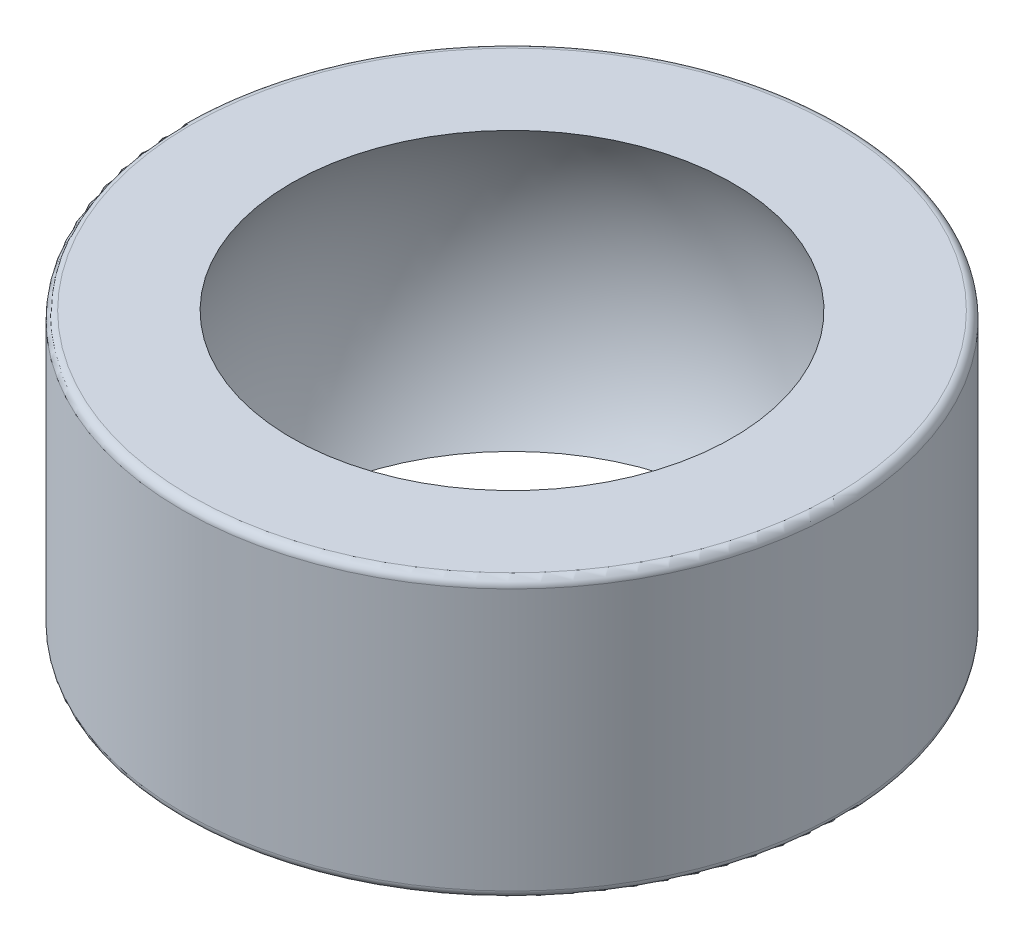
ISO-10303-21;
HEADER;
FILE_DESCRIPTION(('STEP AP214'),'2;1');
FILE_NAME('part.step','',(''),(''),'','','');
FILE_SCHEMA(('AUTOMOTIVE_DESIGN { 1 0 10303 214 1 1 1 1 }'));
ENDSEC;
DATA;
#1=APPLICATION_CONTEXT('core data for automotive mechanical design processes');
#2=APPLICATION_PROTOCOL_DEFINITION('international standard','automotive_design',2000,#1);
#3=PRODUCT_CONTEXT('',#1,'mechanical');
#4=PRODUCT('Part','Part','',(#3));
#5=PRODUCT_RELATED_PRODUCT_CATEGORY('part','',(#4));
#6=PRODUCT_DEFINITION_FORMATION('','',#4);
#7=PRODUCT_DEFINITION_CONTEXT('part definition',#1,'design');
#8=PRODUCT_DEFINITION('design','',#6,#7);
#9=PRODUCT_DEFINITION_SHAPE('','',#8);
#10=(LENGTH_UNIT() NAMED_UNIT(*) SI_UNIT(.MILLI.,.METRE.));
#11=(NAMED_UNIT(*) PLANE_ANGLE_UNIT() SI_UNIT($,.RADIAN.));
#12=(NAMED_UNIT(*) SI_UNIT($,.STERADIAN.) SOLID_ANGLE_UNIT());
#13=UNCERTAINTY_MEASURE_WITH_UNIT(LENGTH_MEASURE(1.E-05),#10,'distance_accuracy_value','');
#14=(GEOMETRIC_REPRESENTATION_CONTEXT(3) GLOBAL_UNCERTAINTY_ASSIGNED_CONTEXT((#13)) GLOBAL_UNIT_ASSIGNED_CONTEXT((#10,
#11,#12)) REPRESENTATION_CONTEXT('',''));
#15=CARTESIAN_POINT('',(0.,0.,0.));
#16=DIRECTION('',(0.,0.,1.));
#17=DIRECTION('',(1.,0.,0.));
#18=AXIS2_PLACEMENT_3D('',#15,#16,#17);
#19=CARTESIAN_POINT('',(0.,3.375,0.));
#20=DIRECTION('',(0.,-1.,0.));
#21=DIRECTION('',(0.,0.,-1.));
#22=AXIS2_PLACEMENT_3D('',#19,#20,#21);
#23=CYLINDRICAL_SURFACE('',#22,8.);
#24=CARTESIAN_POINT('',(0.,-3.175,0.));
#25=DIRECTION('',(0.,1.,0.));
#26=DIRECTION('',(0.,0.,1.));
#27=AXIS2_PLACEMENT_3D('',#24,#25,#26);
#28=CIRCLE('',#27,8.);
#29=CARTESIAN_POINT('',(0.,-3.175,8.));
#30=VERTEX_POINT('',#29);
#31=EDGE_CURVE('E42',#30,#30,#28,.T.);
#32=ORIENTED_EDGE('',*,*,#31,.T.);
#33=EDGE_LOOP('',(#32));
#34=FACE_BOUND('',#33,.T.);
#35=CARTESIAN_POINT('',(0.,3.175,0.));
#36=DIRECTION('',(0.,1.,0.));
#37=DIRECTION('',(0.,0.,1.));
#38=AXIS2_PLACEMENT_3D('',#35,#36,#37);
#39=CIRCLE('',#38,8.);
#40=CARTESIAN_POINT('',(0.,3.175,8.));
#41=VERTEX_POINT('',#40);
#42=EDGE_CURVE('E46',#41,#41,#39,.F.);
#43=ORIENTED_EDGE('',*,*,#42,.T.);
#44=EDGE_LOOP('',(#43));
#45=FACE_BOUND('',#44,.T.);
#46=ADVANCED_FACE('F31',(#34,#45),#23,.T.);
#47=CARTESIAN_POINT('',(0.,3.375,0.));
#48=DIRECTION('',(0.,1.,0.));
#49=DIRECTION('',(0.,0.,1.));
#50=AXIS2_PLACEMENT_3D('',#47,#48,#49);
#51=PLANE('',#50);
#52=CARTESIAN_POINT('',(0.,3.375,0.));
#53=DIRECTION('',(0.,1.,0.));
#54=DIRECTION('',(0.,0.,1.));
#55=AXIS2_PLACEMENT_3D('',#52,#53,#54);
#56=CIRCLE('',#55,7.8);
#57=CARTESIAN_POINT('',(0.,3.375,7.8));
#58=VERTEX_POINT('',#57);
#59=EDGE_CURVE('E10',#58,#58,#56,.T.);
#60=ORIENTED_EDGE('',*,*,#59,.T.);
#61=EDGE_LOOP('',(#60));
#62=FACE_BOUND('',#61,.T.);
#63=CARTESIAN_POINT('',(0.,3.375,0.));
#64=DIRECTION('',(0.,1.,0.));
#65=DIRECTION('',(0.,0.,1.));
#66=AXIS2_PLACEMENT_3D('',#63,#64,#65);
#67=CIRCLE('',#66,5.35521007991283);
#68=CARTESIAN_POINT('',(-5.35521007991283,3.375,0.));
#69=VERTEX_POINT('',#68);
#70=EDGE_CURVE('E51',#69,#69,#67,.T.);
#71=ORIENTED_EDGE('',*,*,#70,.F.);
#72=EDGE_LOOP('',(#71));
#73=FACE_BOUND('',#72,.T.);
#74=ADVANCED_FACE('F61',(#62,#73),#51,.T.);
#75=CARTESIAN_POINT('',(0.,-3.375,0.));
#76=DIRECTION('',(0.,1.,0.));
#77=DIRECTION('',(0.,0.,1.));
#78=AXIS2_PLACEMENT_3D('',#75,#76,#77);
#79=PLANE('',#78);
#80=CARTESIAN_POINT('',(0.,-3.375,0.));
#81=DIRECTION('',(0.,1.,0.));
#82=DIRECTION('',(0.,0.,1.));
#83=AXIS2_PLACEMENT_3D('',#80,#81,#82);
#84=CIRCLE('',#83,7.8);
#85=CARTESIAN_POINT('',(0.,-3.375,7.8));
#86=VERTEX_POINT('',#85);
#87=EDGE_CURVE('E38',#86,#86,#84,.F.);
#88=ORIENTED_EDGE('',*,*,#87,.T.);
#89=EDGE_LOOP('',(#88));
#90=FACE_BOUND('',#89,.T.);
#91=CARTESIAN_POINT('',(0.,-3.375,0.));
#92=DIRECTION('',(0.,1.,0.));
#93=DIRECTION('',(0.,0.,1.));
#94=AXIS2_PLACEMENT_3D('',#91,#92,#93);
#95=CIRCLE('',#94,5.35521007991283);
#96=CARTESIAN_POINT('',(-5.35521007991283,-3.375,0.));
#97=VERTEX_POINT('',#96);
#98=EDGE_CURVE('E52',#97,#97,#95,.T.);
#99=ORIENTED_EDGE('',*,*,#98,.T.);
#100=EDGE_LOOP('',(#99));
#101=FACE_BOUND('',#100,.T.);
#102=ADVANCED_FACE('F63',(#90,#101),#79,.F.);
#103=CARTESIAN_POINT('',(0.,0.,0.));
#104=DIRECTION('',(0.,-1.,0.));
#105=DIRECTION('',(-1.,0.,0.));
#106=AXIS2_PLACEMENT_3D('',#103,#104,#105);
#107=SPHERICAL_SURFACE('',#106,6.33);
#108=CARTESIAN_POINT('',(-5.35521007991283,3.375,0.));
#109=CARTESIAN_POINT('',(-5.3947507784017,3.31226071414972,0.));
#110=CARTESIAN_POINT('',(-5.43318794892836,3.24882599635958,0.));
#111=CARTESIAN_POINT('',(-5.50780995160095,3.12064532711878,0.));
#112=CARTESIAN_POINT('',(-5.54399478374688,3.05589937566812,0.));
#113=CARTESIAN_POINT('',(-5.6140668272017,2.92517586932549,0.));
#114=CARTESIAN_POINT('',(-5.64795403851059,2.85919831443353,0.));
#115=CARTESIAN_POINT('',(-5.71338914123763,2.72609318664218,0.));
#116=CARTESIAN_POINT('',(-5.74493703265577,2.6589656137428,0.));
#117=CARTESIAN_POINT('',(-5.8056544862728,2.52364333956011,0.));
#118=CARTESIAN_POINT('',(-5.83482404847167,2.4554486382768,0.));
#119=CARTESIAN_POINT('',(-5.89074882549115,2.31807634619613,0.));
#120=CARTESIAN_POINT('',(-5.91750404031174,2.24889875539875,0.));
#121=CARTESIAN_POINT('',(-5.96856707221269,2.10964612885016,0.));
#122=CARTESIAN_POINT('',(-5.99287488929305,2.03957109309895,0.));
#123=CARTESIAN_POINT('',(-6.03901310215493,1.89861013194011,0.));
#124=CARTESIAN_POINT('',(-6.06084349793644,1.82772420653248,0.));
#125=CARTESIAN_POINT('',(-6.10199990365746,1.68522902234825,0.));
#126=CARTESIAN_POINT('',(-6.12132591359696,1.61361976357163,0.));
#127=CARTESIAN_POINT('',(-6.15744967671759,1.46976636253963,0.));
#128=CARTESIAN_POINT('',(-6.17424742989872,1.39752222028424,0.));
#129=CARTESIAN_POINT('',(-6.20529393134798,1.25248828633308,0.));
#130=CARTESIAN_POINT('',(-6.21954267961612,1.17969849463731,0.));
#131=CARTESIAN_POINT('',(-6.24547357156782,1.03366316982704,0.));
#132=CARTESIAN_POINT('',(-6.25715571525138,0.960417636712535,0.));
#133=CARTESIAN_POINT('',(-6.27793896855893,0.813561300003052,0.));
#134=CARTESIAN_POINT('',(-6.28704007818291,0.739950496408074,0.));
#135=CARTESIAN_POINT('',(-6.30265002192248,0.592454540849135,0.));
#136=CARTESIAN_POINT('',(-6.30915885603807,0.518569388885174,0.));
#137=CARTESIAN_POINT('',(-6.3195762092216,0.370615997567366,0.));
#138=CARTESIAN_POINT('',(-6.32348472828954,0.29654775821352,0.));
#139=CARTESIAN_POINT('',(-6.32869662367874,0.148319679239782,0.));
#140=CARTESIAN_POINT('',(-6.33,0.0741598396198912,0.));
#141=CARTESIAN_POINT('',(-6.33,-0.0741598396198912,0.));
#142=CARTESIAN_POINT('',(-6.32869662367874,-0.148319679239782,0.));
#143=CARTESIAN_POINT('',(-6.32348472828954,-0.29654775821352,0.));
#144=CARTESIAN_POINT('',(-6.3195762092216,-0.370615997567366,0.));
#145=CARTESIAN_POINT('',(-6.30915885603807,-0.518569388885174,0.));
#146=CARTESIAN_POINT('',(-6.30265002192248,-0.592454540849135,0.));
#147=CARTESIAN_POINT('',(-6.28704007818291,-0.739950496408074,0.));
#148=CARTESIAN_POINT('',(-6.27793896855893,-0.813561300003052,0.));
#149=CARTESIAN_POINT('',(-6.25715571525138,-0.960417636712534,0.));
#150=CARTESIAN_POINT('',(-6.24547357156782,-1.03366316982704,0.));
#151=CARTESIAN_POINT('',(-6.21954267961612,-1.17969849463731,0.));
#152=CARTESIAN_POINT('',(-6.20529393134798,-1.25248828633308,0.));
#153=CARTESIAN_POINT('',(-6.17424742989872,-1.39752222028424,0.));
#154=CARTESIAN_POINT('',(-6.15744967671759,-1.46976636253963,0.));
#155=CARTESIAN_POINT('',(-6.12132591359696,-1.61361976357163,0.));
#156=CARTESIAN_POINT('',(-6.10199990365746,-1.68522902234825,0.));
#157=CARTESIAN_POINT('',(-6.06084349793644,-1.82772420653248,0.));
#158=CARTESIAN_POINT('',(-6.03901310215493,-1.89861013194011,0.));
#159=CARTESIAN_POINT('',(-5.99287488929305,-2.03957109309895,0.));
#160=CARTESIAN_POINT('',(-5.96856707221269,-2.10964612885016,0.));
#161=CARTESIAN_POINT('',(-5.91750404031174,-2.24889875539875,0.));
#162=CARTESIAN_POINT('',(-5.89074882549115,-2.31807634619613,0.));
#163=CARTESIAN_POINT('',(-5.83482404847167,-2.4554486382768,0.));
#164=CARTESIAN_POINT('',(-5.8056544862728,-2.52364333956011,0.));
#165=CARTESIAN_POINT('',(-5.74493703265577,-2.6589656137428,0.));
#166=CARTESIAN_POINT('',(-5.71338914123763,-2.72609318664218,0.));
#167=CARTESIAN_POINT('',(-5.6479540385106,-2.85919831443353,0.));
#168=CARTESIAN_POINT('',(-5.61406682720171,-2.92517586932549,0.));
#169=CARTESIAN_POINT('',(-5.54399478374688,-3.05589937566812,0.));
#170=CARTESIAN_POINT('',(-5.50780995160095,-3.12064532711878,0.));
#171=CARTESIAN_POINT('',(-5.43318794892836,-3.24882599635958,0.));
#172=CARTESIAN_POINT('',(-5.3947507784017,-3.31226071414972,0.));
#173=CARTESIAN_POINT('',(-5.35521007991283,-3.375,0.));
#174=B_SPLINE_CURVE_WITH_KNOTS('',3,(#108,#109,#110,#111,#112,#113,#114,#115,#116,#117,#118,
#119,#120,#121,#122,#123,#124,#125,#126,#127,#128,#129,#130,#131,#132,#133,#134,#135,#136,#137,
#138,#139,#140,#141,#142,#143,#144,#145,#146,#147,#148,#149,#150,#151,#152,#153,#154,#155,#156,
#157,#158,#159,#160,#161,#162,#163,#164,#165,#166,#167,#168,#169,#170,#171,#172,#173),
.UNSPECIFIED.,.F.,.F.,(4,2,2,2,2,2,2,2,2,2,2,2,2,2,2,2,2,2,2,2,2,2,2,2,2,2,2,2,2,2,2,2,4),(0.,
0.222468069710752,0.444936139421503,0.667404209132255,0.889872278843007,1.11234034855376,
1.33480841826451,1.55727648797526,1.77974455768601,2.00221262739676,2.22468069710752,
2.44714876681827,2.66961683652902,2.89208490623977,3.11455297595052,3.33702104566127,
3.55948911537203,3.78195718508278,4.00442525479353,4.22689332450428,4.44936139421503,
4.67182946392578,4.89429753363654,5.11676560334729,5.33923367305804,5.56170174276879,
5.78416981247954,6.00663788219029,6.22910595190105,6.4515740216118,6.67404209132255,
6.8965101610333,7.11897823074405),.UNSPECIFIED.);
#175=EDGE_CURVE('BSEAM58',#69,#97,#174,.T.);
#176=ORIENTED_EDGE('',*,*,#70,.T.);
#177=ORIENTED_EDGE('',*,*,#98,.F.);
#178=ORIENTED_EDGE('',*,*,#175,.T.);
#179=ORIENTED_EDGE('',*,*,#175,.F.);
#180=EDGE_LOOP('',(#176,#178,#177,#179));
#181=FACE_BOUND('',#180,.T.);
#182=ADVANCED_FACE('F58',(#181),#107,.F.);
#183=CARTESIAN_POINT('',(0.,-3.175,0.));
#184=DIRECTION('',(0.,1.,0.));
#185=DIRECTION('',(0.,0.,1.));
#186=AXIS2_PLACEMENT_3D('',#183,#184,#185);
#187=TOROIDAL_SURFACE('',#186,7.8,0.2);
#188=ORIENTED_EDGE('',*,*,#87,.F.);
#189=EDGE_LOOP('',(#188));
#190=FACE_BOUND('',#189,.T.);
#191=ORIENTED_EDGE('',*,*,#31,.F.);
#192=EDGE_LOOP('',(#191));
#193=FACE_BOUND('',#192,.T.);
#194=ADVANCED_FACE('F73',(#190,#193),#187,.T.);
#195=CARTESIAN_POINT('',(0.,3.175,0.));
#196=DIRECTION('',(0.,1.,0.));
#197=DIRECTION('',(0.,0.,1.));
#198=AXIS2_PLACEMENT_3D('',#195,#196,#197);
#199=TOROIDAL_SURFACE('',#198,7.8,0.2);
#200=ORIENTED_EDGE('',*,*,#42,.F.);
#201=EDGE_LOOP('',(#200));
#202=FACE_BOUND('',#201,.T.);
#203=ORIENTED_EDGE('',*,*,#59,.F.);
#204=EDGE_LOOP('',(#203));
#205=FACE_BOUND('',#204,.T.);
#206=ADVANCED_FACE('F33',(#202,#205),#199,.T.);
#207=CLOSED_SHELL('',(#46,#74,#102,#182,#194,#206));
#208=MANIFOLD_SOLID_BREP('B2',#207);
#209=ADVANCED_BREP_SHAPE_REPRESENTATION('',(#18,#208),#14);
#210=SHAPE_DEFINITION_REPRESENTATION(#9,#209);
ENDSEC;
END-ISO-10303-21;
